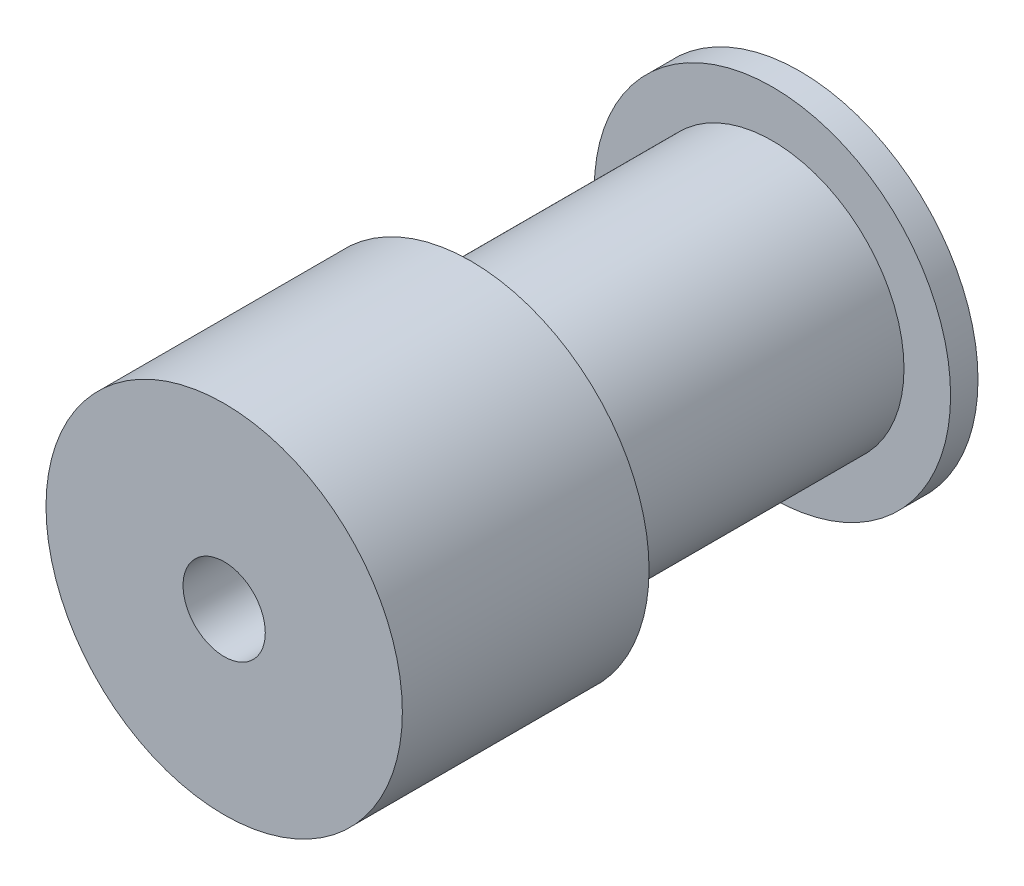
ISO-10303-21;
HEADER;
FILE_DESCRIPTION(('STEP AP214'),'2;1');
FILE_NAME('part.step','',(''),(''),'','','');
FILE_SCHEMA(('AUTOMOTIVE_DESIGN { 1 0 10303 214 1 1 1 1 }'));
ENDSEC;
DATA;
#1=APPLICATION_CONTEXT('core data for automotive mechanical design processes');
#2=APPLICATION_PROTOCOL_DEFINITION('international standard','automotive_design',2000,#1);
#3=PRODUCT_CONTEXT('',#1,'mechanical');
#4=PRODUCT('Part','Part','',(#3));
#5=PRODUCT_RELATED_PRODUCT_CATEGORY('part','',(#4));
#6=PRODUCT_DEFINITION_FORMATION('','',#4);
#7=PRODUCT_DEFINITION_CONTEXT('part definition',#1,'design');
#8=PRODUCT_DEFINITION('design','',#6,#7);
#9=PRODUCT_DEFINITION_SHAPE('','',#8);
#10=(LENGTH_UNIT() NAMED_UNIT(*) SI_UNIT(.MILLI.,.METRE.));
#11=(NAMED_UNIT(*) PLANE_ANGLE_UNIT() SI_UNIT($,.RADIAN.));
#12=(NAMED_UNIT(*) SI_UNIT($,.STERADIAN.) SOLID_ANGLE_UNIT());
#13=UNCERTAINTY_MEASURE_WITH_UNIT(LENGTH_MEASURE(1.E-05),#10,'distance_accuracy_value','');
#14=(GEOMETRIC_REPRESENTATION_CONTEXT(3) GLOBAL_UNCERTAINTY_ASSIGNED_CONTEXT((#13)) GLOBAL_UNIT_ASSIGNED_CONTEXT((#10,
#11,#12)) REPRESENTATION_CONTEXT('',''));
#15=CARTESIAN_POINT('',(0.,0.,0.));
#16=DIRECTION('',(0.,0.,1.));
#17=DIRECTION('',(1.,0.,0.));
#18=AXIS2_PLACEMENT_3D('',#15,#16,#17);
#19=CARTESIAN_POINT('',(0.,0.,9.));
#20=DIRECTION('',(0.,0.,-1.));
#21=DIRECTION('',(-1.,0.,0.));
#22=AXIS2_PLACEMENT_3D('',#19,#20,#21);
#23=CYLINDRICAL_SURFACE('',#22,6.5);
#24=CARTESIAN_POINT('',(0.,0.,21.));
#25=DIRECTION('',(0.,0.,1.));
#26=DIRECTION('',(1.,0.,0.));
#27=AXIS2_PLACEMENT_3D('',#24,#25,#26);
#28=CIRCLE('',#27,6.5);
#29=CARTESIAN_POINT('',(6.5,0.,21.));
#30=VERTEX_POINT('',#29);
#31=EDGE_CURVE('E54',#30,#30,#28,.T.);
#32=ORIENTED_EDGE('',*,*,#31,.F.);
#33=EDGE_LOOP('',(#32));
#34=FACE_BOUND('',#33,.T.);
#35=CARTESIAN_POINT('',(0.,0.,12.));
#36=DIRECTION('',(0.,0.,-1.));
#37=DIRECTION('',(-1.,0.,0.));
#38=AXIS2_PLACEMENT_3D('',#35,#36,#37);
#39=CIRCLE('',#38,6.5);
#40=CARTESIAN_POINT('',(-6.5,0.,12.));
#41=VERTEX_POINT('',#40);
#42=EDGE_CURVE('E66',#41,#41,#39,.T.);
#43=ORIENTED_EDGE('',*,*,#42,.F.);
#44=EDGE_LOOP('',(#43));
#45=FACE_BOUND('',#44,.T.);
#46=ADVANCED_FACE('F39',(#34,#45),#23,.T.);
#47=CARTESIAN_POINT('',(0.,0.,1.));
#48=DIRECTION('',(0.,0.,1.));
#49=DIRECTION('',(1.,0.,0.));
#50=AXIS2_PLACEMENT_3D('',#47,#48,#49);
#51=PLANE('',#50);
#52=CARTESIAN_POINT('',(0.,0.,1.));
#53=DIRECTION('',(0.,0.,1.));
#54=DIRECTION('',(1.,0.,0.));
#55=AXIS2_PLACEMENT_3D('',#52,#53,#54);
#56=CIRCLE('',#55,4.8);
#57=CARTESIAN_POINT('',(4.8,0.,1.));
#58=VERTEX_POINT('',#57);
#59=EDGE_CURVE('E10',#58,#58,#56,.T.);
#60=ORIENTED_EDGE('',*,*,#59,.F.);
#61=EDGE_LOOP('',(#60));
#62=FACE_BOUND('',#61,.T.);
#63=CARTESIAN_POINT('',(0.,0.,1.));
#64=DIRECTION('',(0.,0.,1.));
#65=DIRECTION('',(1.,0.,0.));
#66=AXIS2_PLACEMENT_3D('',#63,#64,#65);
#67=CIRCLE('',#66,6.5);
#68=CARTESIAN_POINT('',(6.5,0.,1.));
#69=VERTEX_POINT('',#68);
#70=EDGE_CURVE('E47',#69,#69,#67,.T.);
#71=ORIENTED_EDGE('',*,*,#70,.T.);
#72=EDGE_LOOP('',(#71));
#73=FACE_BOUND('',#72,.T.);
#74=ADVANCED_FACE('F86',(#62,#73),#51,.T.);
#75=CARTESIAN_POINT('',(0.,0.,0.));
#76=DIRECTION('',(0.,0.,1.));
#77=DIRECTION('',(1.,0.,0.));
#78=AXIS2_PLACEMENT_3D('',#75,#76,#77);
#79=PLANE('',#78);
#80=CARTESIAN_POINT('',(0.,0.,0.));
#81=DIRECTION('',(0.,0.,1.));
#82=DIRECTION('',(1.,0.,0.));
#83=AXIS2_PLACEMENT_3D('',#80,#81,#82);
#84=CIRCLE('',#83,6.5);
#85=CARTESIAN_POINT('',(6.5,0.,0.));
#86=VERTEX_POINT('',#85);
#87=EDGE_CURVE('E43',#86,#86,#84,.T.);
#88=ORIENTED_EDGE('',*,*,#87,.F.);
#89=EDGE_LOOP('',(#88));
#90=FACE_BOUND('',#89,.T.);
#91=CARTESIAN_POINT('',(0.,0.,0.));
#92=DIRECTION('',(0.,0.,1.));
#93=DIRECTION('',(1.,0.,0.));
#94=AXIS2_PLACEMENT_3D('',#91,#92,#93);
#95=CIRCLE('',#94,1.5);
#96=CARTESIAN_POINT('',(1.5,0.,0.));
#97=VERTEX_POINT('',#96);
#98=EDGE_CURVE('E56',#97,#97,#95,.T.);
#99=ORIENTED_EDGE('',*,*,#98,.T.);
#100=EDGE_LOOP('',(#99));
#101=FACE_BOUND('',#100,.T.);
#102=ADVANCED_FACE('F94',(#90,#101),#79,.F.);
#103=CARTESIAN_POINT('',(0.,0.,1.));
#104=DIRECTION('',(0.,0.,-1.));
#105=DIRECTION('',(-1.,0.,0.));
#106=AXIS2_PLACEMENT_3D('',#103,#104,#105);
#107=CYLINDRICAL_SURFACE('',#106,6.5);
#108=ORIENTED_EDGE('',*,*,#70,.F.);
#109=EDGE_LOOP('',(#108));
#110=FACE_BOUND('',#109,.T.);
#111=ORIENTED_EDGE('',*,*,#87,.T.);
#112=EDGE_LOOP('',(#111));
#113=FACE_BOUND('',#112,.T.);
#114=ADVANCED_FACE('F41',(#110,#113),#107,.T.);
#115=CARTESIAN_POINT('',(0.,0.,1.));
#116=DIRECTION('',(0.,0.,-1.));
#117=DIRECTION('',(-1.,0.,0.));
#118=AXIS2_PLACEMENT_3D('',#115,#116,#117);
#119=CYLINDRICAL_SURFACE('',#118,1.5);
#120=ORIENTED_EDGE('',*,*,#98,.F.);
#121=EDGE_LOOP('',(#120));
#122=FACE_BOUND('',#121,.T.);
#123=CARTESIAN_POINT('',(0.,0.,21.));
#124=DIRECTION('',(0.,0.,1.));
#125=DIRECTION('',(1.,0.,0.));
#126=AXIS2_PLACEMENT_3D('',#123,#124,#125);
#127=CIRCLE('',#126,1.5);
#128=CARTESIAN_POINT('',(1.5,0.,21.));
#129=VERTEX_POINT('',#128);
#130=EDGE_CURVE('E62',#129,#129,#127,.T.);
#131=ORIENTED_EDGE('',*,*,#130,.T.);
#132=EDGE_LOOP('',(#131));
#133=FACE_BOUND('',#132,.T.);
#134=ADVANCED_FACE('F100',(#122,#133),#119,.F.);
#135=CARTESIAN_POINT('',(0.,0.,8.));
#136=DIRECTION('',(0.,0.,-1.));
#137=DIRECTION('',(-1.,0.,0.));
#138=AXIS2_PLACEMENT_3D('',#135,#136,#137);
#139=CYLINDRICAL_SURFACE('',#138,4.8);
#140=ORIENTED_EDGE('',*,*,#59,.T.);
#141=EDGE_LOOP('',(#140));
#142=FACE_BOUND('',#141,.T.);
#143=CARTESIAN_POINT('',(0.,0.,12.));
#144=DIRECTION('',(0.,0.,-1.));
#145=DIRECTION('',(-1.,0.,0.));
#146=AXIS2_PLACEMENT_3D('',#143,#144,#145);
#147=CIRCLE('',#146,4.8);
#148=CARTESIAN_POINT('',(-4.8,0.,12.));
#149=VERTEX_POINT('',#148);
#150=EDGE_CURVE('E70',#149,#149,#147,.T.);
#151=ORIENTED_EDGE('',*,*,#150,.T.);
#152=EDGE_LOOP('',(#151));
#153=FACE_BOUND('',#152,.T.);
#154=ADVANCED_FACE('F76',(#142,#153),#139,.T.);
#155=CARTESIAN_POINT('',(0.,0.,21.));
#156=DIRECTION('',(0.,0.,1.));
#157=DIRECTION('',(1.,0.,0.));
#158=AXIS2_PLACEMENT_3D('',#155,#156,#157);
#159=PLANE('',#158);
#160=ORIENTED_EDGE('',*,*,#31,.T.);
#161=EDGE_LOOP('',(#160));
#162=FACE_BOUND('',#161,.T.);
#163=ORIENTED_EDGE('',*,*,#130,.F.);
#164=EDGE_LOOP('',(#163));
#165=FACE_BOUND('',#164,.T.);
#166=ADVANCED_FACE('F81',(#162,#165),#159,.T.);
#167=CARTESIAN_POINT('',(0.,0.,12.));
#168=DIRECTION('',(0.,0.,-1.));
#169=DIRECTION('',(-1.,0.,0.));
#170=AXIS2_PLACEMENT_3D('',#167,#168,#169);
#171=PLANE('',#170);
#172=ORIENTED_EDGE('',*,*,#150,.F.);
#173=EDGE_LOOP('',(#172));
#174=FACE_BOUND('',#173,.T.);
#175=ORIENTED_EDGE('',*,*,#42,.T.);
#176=EDGE_LOOP('',(#175));
#177=FACE_BOUND('',#176,.T.);
#178=ADVANCED_FACE('F78',(#174,#177),#171,.T.);
#179=CLOSED_SHELL('',(#46,#74,#102,#114,#134,#154,#166,#178));
#180=MANIFOLD_SOLID_BREP('B2',#179);
#181=ADVANCED_BREP_SHAPE_REPRESENTATION('',(#18,#180),#14);
#182=SHAPE_DEFINITION_REPRESENTATION(#9,#181);
ENDSEC;
END-ISO-10303-21;
